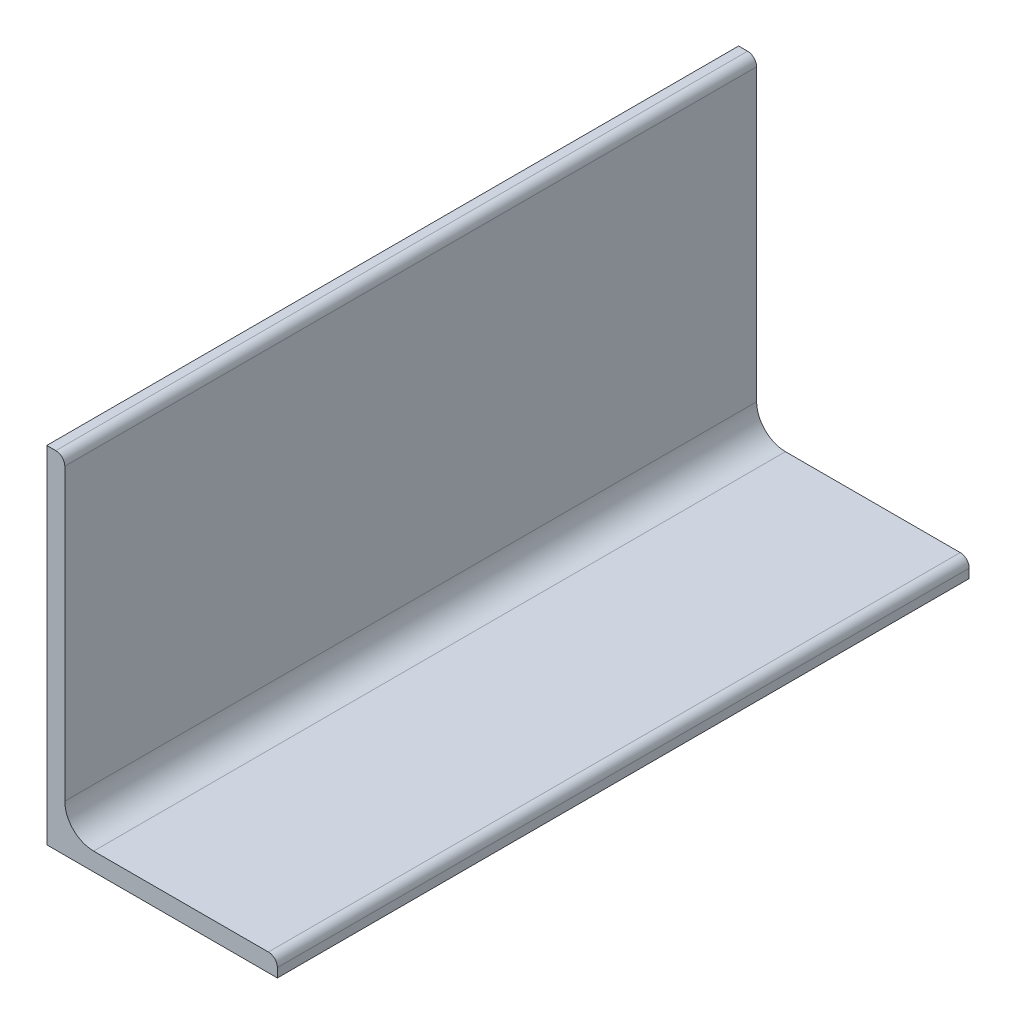
ISO-10303-21;
HEADER;
FILE_DESCRIPTION(('STEP AP214'),'2;1');
FILE_NAME('part.step','',(''),(''),'','','');
FILE_SCHEMA(('AUTOMOTIVE_DESIGN { 1 0 10303 214 1 1 1 1 }'));
ENDSEC;
DATA;
#1=APPLICATION_CONTEXT('core data for automotive mechanical design processes');
#2=APPLICATION_PROTOCOL_DEFINITION('international standard','automotive_design',2000,#1);
#3=PRODUCT_CONTEXT('',#1,'mechanical');
#4=PRODUCT('Part','Part','',(#3));
#5=PRODUCT_RELATED_PRODUCT_CATEGORY('part','',(#4));
#6=PRODUCT_DEFINITION_FORMATION('','',#4);
#7=PRODUCT_DEFINITION_CONTEXT('part definition',#1,'design');
#8=PRODUCT_DEFINITION('design','',#6,#7);
#9=PRODUCT_DEFINITION_SHAPE('','',#8);
#10=(LENGTH_UNIT() NAMED_UNIT(*) SI_UNIT(.MILLI.,.METRE.));
#11=(NAMED_UNIT(*) PLANE_ANGLE_UNIT() SI_UNIT($,.RADIAN.));
#12=(NAMED_UNIT(*) SI_UNIT($,.STERADIAN.) SOLID_ANGLE_UNIT());
#13=UNCERTAINTY_MEASURE_WITH_UNIT(LENGTH_MEASURE(1.E-05),#10,'distance_accuracy_value','');
#14=(GEOMETRIC_REPRESENTATION_CONTEXT(3) GLOBAL_UNCERTAINTY_ASSIGNED_CONTEXT((#13)) GLOBAL_UNIT_ASSIGNED_CONTEXT((#10,
#11,#12)) REPRESENTATION_CONTEXT('',''));
#15=CARTESIAN_POINT('',(0.,0.,0.));
#16=DIRECTION('',(0.,0.,1.));
#17=DIRECTION('',(1.,0.,0.));
#18=AXIS2_PLACEMENT_3D('',#15,#16,#17);
#19=CARTESIAN_POINT('',(0.865045893659089,152.925428131371,304.8));
#20=DIRECTION('',(1.,0.,0.));
#21=DIRECTION('',(0.,0.,-1.));
#22=AXIS2_PLACEMENT_3D('',#19,#20,#21);
#23=PLANE('',#22);
#24=DIRECTION('',(0.,-1.,0.));
#25=VECTOR('',#24,1.);
#26=CARTESIAN_POINT('',(0.865045893659089,152.925428131371,0.));
#27=LINE('',#26,#25);
#28=CARTESIAN_POINT('',(0.865045893659089,152.925428131371,0.));
#29=VERTEX_POINT('',#28);
#30=CARTESIAN_POINT('',(0.865045893659089,0.525428131371291,0.));
#31=VERTEX_POINT('',#30);
#32=EDGE_CURVE('E135',#29,#31,#27,.T.);
#33=ORIENTED_EDGE('',*,*,#32,.T.);
#34=DIRECTION('',(0.,0.,-1.));
#35=VECTOR('',#34,1.);
#36=CARTESIAN_POINT('',(0.865045893659089,0.525428131371291,304.8));
#37=LINE('',#36,#35);
#38=CARTESIAN_POINT('',(0.865045893659089,0.525428131371291,304.8));
#39=VERTEX_POINT('',#38);
#40=EDGE_CURVE('E11',#39,#31,#37,.T.);
#41=ORIENTED_EDGE('',*,*,#40,.F.);
#42=DIRECTION('',(0.,-1.,0.));
#43=VECTOR('',#42,1.);
#44=CARTESIAN_POINT('',(0.865045893659089,152.925428131371,304.8));
#45=LINE('',#44,#43);
#46=CARTESIAN_POINT('',(0.865045893659089,152.925428131371,304.8));
#47=VERTEX_POINT('',#46);
#48=EDGE_CURVE('E151',#47,#39,#45,.T.);
#49=ORIENTED_EDGE('',*,*,#48,.F.);
#50=DIRECTION('',(0.,0.,-1.));
#51=VECTOR('',#50,1.);
#52=CARTESIAN_POINT('',(0.865045893659089,152.925428131371,304.8));
#53=LINE('',#52,#51);
#54=EDGE_CURVE('E131',#47,#29,#53,.T.);
#55=ORIENTED_EDGE('',*,*,#54,.T.);
#56=EDGE_LOOP('',(#33,#41,#49,#55));
#57=FACE_BOUND('',#56,.T.);
#58=ADVANCED_FACE('F33',(#57),#23,.F.);
#59=CARTESIAN_POINT('',(0.865045893659089,0.525428131371291,304.8));
#60=DIRECTION('',(0.,1.,0.));
#61=DIRECTION('',(0.,0.,1.));
#62=AXIS2_PLACEMENT_3D('',#59,#60,#61);
#63=PLANE('',#62);
#64=DIRECTION('',(1.,0.,0.));
#65=VECTOR('',#64,1.);
#66=CARTESIAN_POINT('',(0.865045893659089,0.525428131371291,0.));
#67=LINE('',#66,#65);
#68=CARTESIAN_POINT('',(102.465045893659,0.525428131371291,0.));
#69=VERTEX_POINT('',#68);
#70=EDGE_CURVE('E138',#31,#69,#67,.T.);
#71=ORIENTED_EDGE('',*,*,#70,.T.);
#72=DIRECTION('',(0.,0.,-1.));
#73=VECTOR('',#72,1.);
#74=CARTESIAN_POINT('',(102.465045893659,0.525428131371291,304.8));
#75=LINE('',#74,#73);
#76=CARTESIAN_POINT('',(102.465045893659,0.525428131371291,304.8));
#77=VERTEX_POINT('',#76);
#78=EDGE_CURVE('E41',#77,#69,#75,.T.);
#79=ORIENTED_EDGE('',*,*,#78,.F.);
#80=DIRECTION('',(1.,0.,0.));
#81=VECTOR('',#80,1.);
#82=CARTESIAN_POINT('',(0.865045893659089,0.525428131371291,304.8));
#83=LINE('',#82,#81);
#84=EDGE_CURVE('E95',#39,#77,#83,.T.);
#85=ORIENTED_EDGE('',*,*,#84,.F.);
#86=ORIENTED_EDGE('',*,*,#40,.T.);
#87=EDGE_LOOP('',(#71,#79,#85,#86));
#88=FACE_BOUND('',#87,.T.);
#89=ADVANCED_FACE('F194',(#88),#63,.F.);
#90=CARTESIAN_POINT('',(102.465045893659,0.525428131371291,304.8));
#91=DIRECTION('',(-1.,0.,0.));
#92=DIRECTION('',(0.,0.,1.));
#93=AXIS2_PLACEMENT_3D('',#90,#91,#92);
#94=PLANE('',#93);
#95=DIRECTION('',(0.,1.,0.));
#96=VECTOR('',#95,1.);
#97=CARTESIAN_POINT('',(102.465045893659,0.525428131371291,0.));
#98=LINE('',#97,#96);
#99=CARTESIAN_POINT('',(102.465045893659,4.49417813137129,0.));
#100=VERTEX_POINT('',#99);
#101=EDGE_CURVE('E140',#69,#100,#98,.T.);
#102=ORIENTED_EDGE('',*,*,#101,.T.);
#103=DIRECTION('',(0.,0.,-1.));
#104=VECTOR('',#103,1.);
#105=CARTESIAN_POINT('',(102.465045893659,4.49417813137129,304.8));
#106=LINE('',#105,#104);
#107=CARTESIAN_POINT('',(102.465045893659,4.49417813137129,304.8));
#108=VERTEX_POINT('',#107);
#109=EDGE_CURVE('E161',#108,#100,#106,.T.);
#110=ORIENTED_EDGE('',*,*,#109,.F.);
#111=DIRECTION('',(0.,1.,0.));
#112=VECTOR('',#111,1.);
#113=CARTESIAN_POINT('',(102.465045893659,0.525428131371291,304.8));
#114=LINE('',#113,#112);
#115=EDGE_CURVE('E169',#77,#108,#114,.T.);
#116=ORIENTED_EDGE('',*,*,#115,.F.);
#117=ORIENTED_EDGE('',*,*,#78,.T.);
#118=EDGE_LOOP('',(#102,#110,#116,#117));
#119=FACE_BOUND('',#118,.T.);
#120=ADVANCED_FACE('F167',(#119),#94,.F.);
#121=CARTESIAN_POINT('',(98.4962958936591,4.49417813137129,304.8));
#122=DIRECTION('',(0.,0.,-1.));
#123=DIRECTION('',(-1.,0.,0.));
#124=AXIS2_PLACEMENT_3D('',#121,#122,#123);
#125=CYLINDRICAL_SURFACE('',#124,3.96875);
#126=CARTESIAN_POINT('',(98.4962958936591,4.49417813137129,0.));
#127=DIRECTION('',(0.,0.,1.));
#128=DIRECTION('',(1.,0.,0.));
#129=AXIS2_PLACEMENT_3D('',#126,#127,#128);
#130=CIRCLE('',#129,3.96875);
#131=CARTESIAN_POINT('',(98.4962958936591,8.46292813137129,0.));
#132=VERTEX_POINT('',#131);
#133=EDGE_CURVE('E142',#100,#132,#130,.T.);
#134=ORIENTED_EDGE('',*,*,#133,.T.);
#135=DIRECTION('',(0.,0.,-1.));
#136=VECTOR('',#135,1.);
#137=CARTESIAN_POINT('',(98.4962958936591,8.46292813137129,304.8));
#138=LINE('',#137,#136);
#139=CARTESIAN_POINT('',(98.4962958936591,8.46292813137129,304.8));
#140=VERTEX_POINT('',#139);
#141=EDGE_CURVE('E158',#140,#132,#138,.T.);
#142=ORIENTED_EDGE('',*,*,#141,.F.);
#143=CARTESIAN_POINT('',(98.4962958936591,4.49417813137129,304.8));
#144=DIRECTION('',(0.,0.,1.));
#145=DIRECTION('',(1.,0.,0.));
#146=AXIS2_PLACEMENT_3D('',#143,#144,#145);
#147=CIRCLE('',#146,3.96875);
#148=EDGE_CURVE('E185',#108,#140,#147,.T.);
#149=ORIENTED_EDGE('',*,*,#148,.F.);
#150=ORIENTED_EDGE('',*,*,#109,.T.);
#151=EDGE_LOOP('',(#134,#142,#149,#150));
#152=FACE_BOUND('',#151,.T.);
#153=ADVANCED_FACE('F178',(#152),#125,.T.);
#154=CARTESIAN_POINT('',(98.4962958936591,8.46292813137129,304.8));
#155=DIRECTION('',(0.,-1.,0.));
#156=DIRECTION('',(0.,0.,-1.));
#157=AXIS2_PLACEMENT_3D('',#154,#155,#156);
#158=PLANE('',#157);
#159=DIRECTION('',(-1.,0.,0.));
#160=VECTOR('',#159,1.);
#161=CARTESIAN_POINT('',(98.4962958936591,8.46292813137129,0.));
#162=LINE('',#161,#160);
#163=CARTESIAN_POINT('',(21.5025458936591,8.46292813137129,0.));
#164=VERTEX_POINT('',#163);
#165=EDGE_CURVE('E144',#132,#164,#162,.T.);
#166=ORIENTED_EDGE('',*,*,#165,.T.);
#167=DIRECTION('',(0.,0.,-1.));
#168=VECTOR('',#167,1.);
#169=CARTESIAN_POINT('',(21.5025458936591,8.46292813137129,304.8));
#170=LINE('',#169,#168);
#171=CARTESIAN_POINT('',(21.5025458936591,8.46292813137129,304.8));
#172=VERTEX_POINT('',#171);
#173=EDGE_CURVE('E155',#172,#164,#170,.T.);
#174=ORIENTED_EDGE('',*,*,#173,.F.);
#175=DIRECTION('',(-1.,0.,0.));
#176=VECTOR('',#175,1.);
#177=CARTESIAN_POINT('',(98.4962958936591,8.46292813137129,304.8));
#178=LINE('',#177,#176);
#179=EDGE_CURVE('E184',#140,#172,#178,.T.);
#180=ORIENTED_EDGE('',*,*,#179,.F.);
#181=ORIENTED_EDGE('',*,*,#141,.T.);
#182=EDGE_LOOP('',(#166,#174,#180,#181));
#183=FACE_BOUND('',#182,.T.);
#184=ADVANCED_FACE('F182',(#183),#158,.F.);
#185=CARTESIAN_POINT('',(21.5025458936591,21.1629281313713,304.8));
#186=DIRECTION('',(0.,0.,-1.));
#187=DIRECTION('',(-1.,0.,0.));
#188=AXIS2_PLACEMENT_3D('',#185,#186,#187);
#189=CYLINDRICAL_SURFACE('',#188,12.7);
#190=CARTESIAN_POINT('',(21.5025458936591,21.1629281313713,0.));
#191=DIRECTION('',(0.,0.,-1.));
#192=DIRECTION('',(1.,0.,0.));
#193=AXIS2_PLACEMENT_3D('',#190,#191,#192);
#194=CIRCLE('',#193,12.7);
#195=CARTESIAN_POINT('',(8.80254589365909,21.1629281313713,0.));
#196=VERTEX_POINT('',#195);
#197=EDGE_CURVE('E146',#164,#196,#194,.T.);
#198=ORIENTED_EDGE('',*,*,#197,.T.);
#199=DIRECTION('',(0.,0.,-1.));
#200=VECTOR('',#199,1.);
#201=CARTESIAN_POINT('',(8.80254589365909,21.1629281313713,304.8));
#202=LINE('',#201,#200);
#203=CARTESIAN_POINT('',(8.80254589365909,21.1629281313713,304.8));
#204=VERTEX_POINT('',#203);
#205=EDGE_CURVE('E126',#204,#196,#202,.T.);
#206=ORIENTED_EDGE('',*,*,#205,.F.);
#207=CARTESIAN_POINT('',(21.5025458936591,21.1629281313713,304.8));
#208=DIRECTION('',(0.,0.,-1.));
#209=DIRECTION('',(1.,0.,0.));
#210=AXIS2_PLACEMENT_3D('',#207,#208,#209);
#211=CIRCLE('',#210,12.7);
#212=EDGE_CURVE('E117',#172,#204,#211,.T.);
#213=ORIENTED_EDGE('',*,*,#212,.F.);
#214=ORIENTED_EDGE('',*,*,#173,.T.);
#215=EDGE_LOOP('',(#198,#206,#213,#214));
#216=FACE_BOUND('',#215,.T.);
#217=ADVANCED_FACE('F206',(#216),#189,.F.);
#218=CARTESIAN_POINT('',(8.80254589365909,21.1629281313713,304.8));
#219=DIRECTION('',(-1.,0.,0.));
#220=DIRECTION('',(0.,0.,1.));
#221=AXIS2_PLACEMENT_3D('',#218,#219,#220);
#222=PLANE('',#221);
#223=DIRECTION('',(0.,1.,0.));
#224=VECTOR('',#223,1.);
#225=CARTESIAN_POINT('',(8.80254589365909,21.1629281313713,0.));
#226=LINE('',#225,#224);
#227=CARTESIAN_POINT('',(8.80254589365909,148.956678131371,0.));
#228=VERTEX_POINT('',#227);
#229=EDGE_CURVE('E125',#196,#228,#226,.T.);
#230=ORIENTED_EDGE('',*,*,#229,.T.);
#231=DIRECTION('',(0.,0.,-1.));
#232=VECTOR('',#231,1.);
#233=CARTESIAN_POINT('',(8.80254589365909,148.956678131371,304.8));
#234=LINE('',#233,#232);
#235=CARTESIAN_POINT('',(8.80254589365909,148.956678131371,304.8));
#236=VERTEX_POINT('',#235);
#237=EDGE_CURVE('E122',#236,#228,#234,.T.);
#238=ORIENTED_EDGE('',*,*,#237,.F.);
#239=DIRECTION('',(0.,1.,0.));
#240=VECTOR('',#239,1.);
#241=CARTESIAN_POINT('',(8.80254589365909,21.1629281313713,304.8));
#242=LINE('',#241,#240);
#243=EDGE_CURVE('E111',#204,#236,#242,.T.);
#244=ORIENTED_EDGE('',*,*,#243,.F.);
#245=ORIENTED_EDGE('',*,*,#205,.T.);
#246=EDGE_LOOP('',(#230,#238,#244,#245));
#247=FACE_BOUND('',#246,.T.);
#248=ADVANCED_FACE('F123',(#247),#222,.F.);
#249=CARTESIAN_POINT('',(4.83379589365909,148.956678131371,304.8));
#250=DIRECTION('',(0.,0.,-1.));
#251=DIRECTION('',(-1.,0.,0.));
#252=AXIS2_PLACEMENT_3D('',#249,#250,#251);
#253=CYLINDRICAL_SURFACE('',#252,3.96875);
#254=CARTESIAN_POINT('',(4.83379589365909,148.956678131371,0.));
#255=DIRECTION('',(0.,0.,1.));
#256=DIRECTION('',(1.,0.,0.));
#257=AXIS2_PLACEMENT_3D('',#254,#255,#256);
#258=CIRCLE('',#257,3.96875);
#259=CARTESIAN_POINT('',(4.83379589365909,152.925428131371,0.));
#260=VERTEX_POINT('',#259);
#261=EDGE_CURVE('E81',#228,#260,#258,.T.);
#262=ORIENTED_EDGE('',*,*,#261,.T.);
#263=DIRECTION('',(0.,0.,-1.));
#264=VECTOR('',#263,1.);
#265=CARTESIAN_POINT('',(4.83379589365909,152.925428131371,304.8));
#266=LINE('',#265,#264);
#267=CARTESIAN_POINT('',(4.83379589365909,152.925428131371,304.8));
#268=VERTEX_POINT('',#267);
#269=EDGE_CURVE('E127',#268,#260,#266,.T.);
#270=ORIENTED_EDGE('',*,*,#269,.F.);
#271=CARTESIAN_POINT('',(4.83379589365909,148.956678131371,304.8));
#272=DIRECTION('',(0.,0.,1.));
#273=DIRECTION('',(1.,0.,0.));
#274=AXIS2_PLACEMENT_3D('',#271,#272,#273);
#275=CIRCLE('',#274,3.96875);
#276=EDGE_CURVE('E115',#236,#268,#275,.T.);
#277=ORIENTED_EDGE('',*,*,#276,.F.);
#278=ORIENTED_EDGE('',*,*,#237,.T.);
#279=EDGE_LOOP('',(#262,#270,#277,#278));
#280=FACE_BOUND('',#279,.T.);
#281=ADVANCED_FACE('F129',(#280),#253,.T.);
#282=CARTESIAN_POINT('',(4.83379589365909,152.925428131371,304.8));
#283=DIRECTION('',(0.,-1.,0.));
#284=DIRECTION('',(0.,0.,-1.));
#285=AXIS2_PLACEMENT_3D('',#282,#283,#284);
#286=PLANE('',#285);
#287=DIRECTION('',(-1.,0.,0.));
#288=VECTOR('',#287,1.);
#289=CARTESIAN_POINT('',(4.83379589365909,152.925428131371,0.));
#290=LINE('',#289,#288);
#291=EDGE_CURVE('E87',#260,#29,#290,.T.);
#292=ORIENTED_EDGE('',*,*,#291,.T.);
#293=ORIENTED_EDGE('',*,*,#54,.F.);
#294=DIRECTION('',(-1.,0.,0.));
#295=VECTOR('',#294,1.);
#296=CARTESIAN_POINT('',(4.83379589365909,152.925428131371,304.8));
#297=LINE('',#296,#295);
#298=EDGE_CURVE('E49',#268,#47,#297,.T.);
#299=ORIENTED_EDGE('',*,*,#298,.F.);
#300=ORIENTED_EDGE('',*,*,#269,.T.);
#301=EDGE_LOOP('',(#292,#293,#299,#300));
#302=FACE_BOUND('',#301,.T.);
#303=ADVANCED_FACE('F214',(#302),#286,.F.);
#304=CARTESIAN_POINT('',(98.4962958936591,4.49417813137129,304.8));
#305=DIRECTION('',(0.,0.,1.));
#306=DIRECTION('',(1.,0.,0.));
#307=AXIS2_PLACEMENT_3D('',#304,#305,#306);
#308=PLANE('',#307);
#309=ORIENTED_EDGE('',*,*,#48,.T.);
#310=ORIENTED_EDGE('',*,*,#84,.T.);
#311=ORIENTED_EDGE('',*,*,#115,.T.);
#312=ORIENTED_EDGE('',*,*,#148,.T.);
#313=ORIENTED_EDGE('',*,*,#179,.T.);
#314=ORIENTED_EDGE('',*,*,#212,.T.);
#315=ORIENTED_EDGE('',*,*,#243,.T.);
#316=ORIENTED_EDGE('',*,*,#276,.T.);
#317=ORIENTED_EDGE('',*,*,#298,.T.);
#318=EDGE_LOOP('',(#309,#310,#311,#312,#313,#314,#315,#316,#317));
#319=FACE_BOUND('',#318,.T.);
#320=ADVANCED_FACE('F113',(#319),#308,.T.);
#321=CARTESIAN_POINT('',(98.4962958936591,4.49417813137129,0.));
#322=DIRECTION('',(0.,0.,1.));
#323=DIRECTION('',(1.,0.,0.));
#324=AXIS2_PLACEMENT_3D('',#321,#322,#323);
#325=PLANE('',#324);
#326=ORIENTED_EDGE('',*,*,#32,.F.);
#327=ORIENTED_EDGE('',*,*,#291,.F.);
#328=ORIENTED_EDGE('',*,*,#261,.F.);
#329=ORIENTED_EDGE('',*,*,#229,.F.);
#330=ORIENTED_EDGE('',*,*,#197,.F.);
#331=ORIENTED_EDGE('',*,*,#165,.F.);
#332=ORIENTED_EDGE('',*,*,#133,.F.);
#333=ORIENTED_EDGE('',*,*,#101,.F.);
#334=ORIENTED_EDGE('',*,*,#70,.F.);
#335=EDGE_LOOP('',(#326,#327,#328,#329,#330,#331,#332,#333,#334));
#336=FACE_BOUND('',#335,.T.);
#337=ADVANCED_FACE('F173',(#336),#325,.F.);
#338=CLOSED_SHELL('',(#58,#89,#120,#153,#184,#217,#248,#281,#303,#320,#337));
#339=MANIFOLD_SOLID_BREP('B2',#338);
#340=ADVANCED_BREP_SHAPE_REPRESENTATION('',(#18,#339),#14);
#341=SHAPE_DEFINITION_REPRESENTATION(#9,#340);
ENDSEC;
END-ISO-10303-21;
